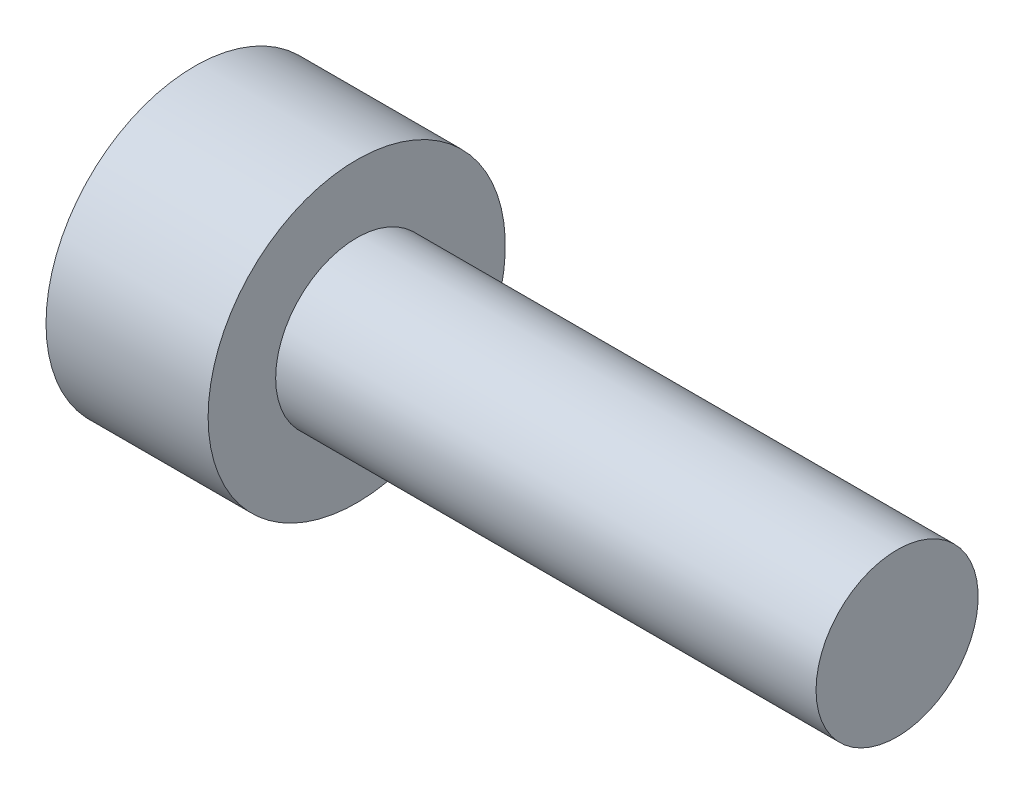
ISO-10303-21;
HEADER;
FILE_DESCRIPTION(('STEP AP214'),'2;1');
FILE_NAME('part.step','',(''),(''),'','','');
FILE_SCHEMA(('AUTOMOTIVE_DESIGN { 1 0 10303 214 1 1 1 1 }'));
ENDSEC;
DATA;
#1=APPLICATION_CONTEXT('core data for automotive mechanical design processes');
#2=APPLICATION_PROTOCOL_DEFINITION('international standard','automotive_design',2000,#1);
#3=PRODUCT_CONTEXT('',#1,'mechanical');
#4=PRODUCT('Part','Part','',(#3));
#5=PRODUCT_RELATED_PRODUCT_CATEGORY('part','',(#4));
#6=PRODUCT_DEFINITION_FORMATION('','',#4);
#7=PRODUCT_DEFINITION_CONTEXT('part definition',#1,'design');
#8=PRODUCT_DEFINITION('design','',#6,#7);
#9=PRODUCT_DEFINITION_SHAPE('','',#8);
#10=(LENGTH_UNIT() NAMED_UNIT(*) SI_UNIT(.MILLI.,.METRE.));
#11=(NAMED_UNIT(*) PLANE_ANGLE_UNIT() SI_UNIT($,.RADIAN.));
#12=(NAMED_UNIT(*) SI_UNIT($,.STERADIAN.) SOLID_ANGLE_UNIT());
#13=UNCERTAINTY_MEASURE_WITH_UNIT(LENGTH_MEASURE(1.E-05),#10,'distance_accuracy_value','');
#14=(GEOMETRIC_REPRESENTATION_CONTEXT(3) GLOBAL_UNCERTAINTY_ASSIGNED_CONTEXT((#13)) GLOBAL_UNIT_ASSIGNED_CONTEXT((#10,
#11,#12)) REPRESENTATION_CONTEXT('',''));
#15=CARTESIAN_POINT('',(0.,0.,0.));
#16=DIRECTION('',(0.,0.,1.));
#17=DIRECTION('',(1.,0.,0.));
#18=AXIS2_PLACEMENT_3D('',#15,#16,#17);
#19=CARTESIAN_POINT('',(6.7,2.75,0.));
#20=DIRECTION('',(1.,0.,0.));
#21=DIRECTION('',(0.,0.,-1.));
#22=AXIS2_PLACEMENT_3D('',#19,#20,#21);
#23=PLANE('',#22);
#24=CARTESIAN_POINT('',(6.7,0.,0.));
#25=DIRECTION('',(-1.,0.,0.));
#26=DIRECTION('',(0.,0.,1.));
#27=AXIS2_PLACEMENT_3D('',#24,#25,#26);
#28=CIRCLE('',#27,2.75);
#29=CARTESIAN_POINT('',(6.7,0.,2.75));
#30=VERTEX_POINT('',#29);
#31=EDGE_CURVE('E45',#30,#30,#28,.T.);
#32=ORIENTED_EDGE('',*,*,#31,.T.);
#33=EDGE_LOOP('',(#32));
#34=FACE_BOUND('',#33,.T.);
#35=ADVANCED_FACE('F31',(#34),#23,.F.);
#36=CARTESIAN_POINT('',(19.7,0.,0.));
#37=DIRECTION('',(-1.,0.,0.));
#38=DIRECTION('',(0.,0.,1.));
#39=AXIS2_PLACEMENT_3D('',#36,#37,#38);
#40=PLANE('',#39);
#41=CARTESIAN_POINT('',(19.7,0.,0.));
#42=DIRECTION('',(-1.,0.,0.));
#43=DIRECTION('',(0.,0.,1.));
#44=AXIS2_PLACEMENT_3D('',#41,#42,#43);
#45=CIRCLE('',#44,1.5);
#46=CARTESIAN_POINT('',(19.7,0.,1.5));
#47=VERTEX_POINT('',#46);
#48=EDGE_CURVE('E10',#47,#47,#45,.T.);
#49=ORIENTED_EDGE('',*,*,#48,.F.);
#50=EDGE_LOOP('',(#49));
#51=FACE_BOUND('',#50,.T.);
#52=ADVANCED_FACE('F65',(#51),#40,.F.);
#53=CARTESIAN_POINT('',(-110.,0.,0.));
#54=DIRECTION('',(-1.,0.,0.));
#55=DIRECTION('',(0.,0.,1.));
#56=AXIS2_PLACEMENT_3D('',#53,#54,#55);
#57=CYLINDRICAL_SURFACE('',#56,1.5);
#58=CARTESIAN_POINT('',(9.7,0.,0.));
#59=DIRECTION('',(-1.,0.,0.));
#60=DIRECTION('',(0.,0.,1.));
#61=AXIS2_PLACEMENT_3D('',#58,#59,#60);
#62=CIRCLE('',#61,1.5);
#63=CARTESIAN_POINT('',(9.7,0.,1.5));
#64=VERTEX_POINT('',#63);
#65=EDGE_CURVE('E37',#64,#64,#62,.T.);
#66=ORIENTED_EDGE('',*,*,#65,.F.);
#67=EDGE_LOOP('',(#66));
#68=FACE_BOUND('',#67,.T.);
#69=ORIENTED_EDGE('',*,*,#48,.T.);
#70=EDGE_LOOP('',(#69));
#71=FACE_BOUND('',#70,.T.);
#72=ADVANCED_FACE('F60',(#68,#71),#57,.T.);
#73=CARTESIAN_POINT('',(9.7,1.5,0.));
#74=DIRECTION('',(-1.,0.,0.));
#75=DIRECTION('',(0.,0.,1.));
#76=AXIS2_PLACEMENT_3D('',#73,#74,#75);
#77=PLANE('',#76);
#78=CARTESIAN_POINT('',(9.7,0.,0.));
#79=DIRECTION('',(-1.,0.,0.));
#80=DIRECTION('',(0.,0.,1.));
#81=AXIS2_PLACEMENT_3D('',#78,#79,#80);
#82=CIRCLE('',#81,2.75);
#83=CARTESIAN_POINT('',(9.7,0.,2.75));
#84=VERTEX_POINT('',#83);
#85=EDGE_CURVE('E41',#84,#84,#82,.T.);
#86=ORIENTED_EDGE('',*,*,#85,.F.);
#87=EDGE_LOOP('',(#86));
#88=FACE_BOUND('',#87,.T.);
#89=ORIENTED_EDGE('',*,*,#65,.T.);
#90=EDGE_LOOP('',(#89));
#91=FACE_BOUND('',#90,.T.);
#92=ADVANCED_FACE('F55',(#88,#91),#77,.F.);
#93=CARTESIAN_POINT('',(-110.,0.,0.));
#94=DIRECTION('',(-1.,0.,0.));
#95=DIRECTION('',(0.,0.,1.));
#96=AXIS2_PLACEMENT_3D('',#93,#94,#95);
#97=CYLINDRICAL_SURFACE('',#96,2.75);
#98=ORIENTED_EDGE('',*,*,#31,.F.);
#99=EDGE_LOOP('',(#98));
#100=FACE_BOUND('',#99,.T.);
#101=ORIENTED_EDGE('',*,*,#85,.T.);
#102=EDGE_LOOP('',(#101));
#103=FACE_BOUND('',#102,.T.);
#104=ADVANCED_FACE('F52',(#100,#103),#97,.T.);
#105=CLOSED_SHELL('',(#35,#52,#72,#92,#104));
#106=MANIFOLD_SOLID_BREP('B2',#105);
#107=ADVANCED_BREP_SHAPE_REPRESENTATION('',(#18,#106),#14);
#108=SHAPE_DEFINITION_REPRESENTATION(#9,#107);
ENDSEC;
END-ISO-10303-21;
